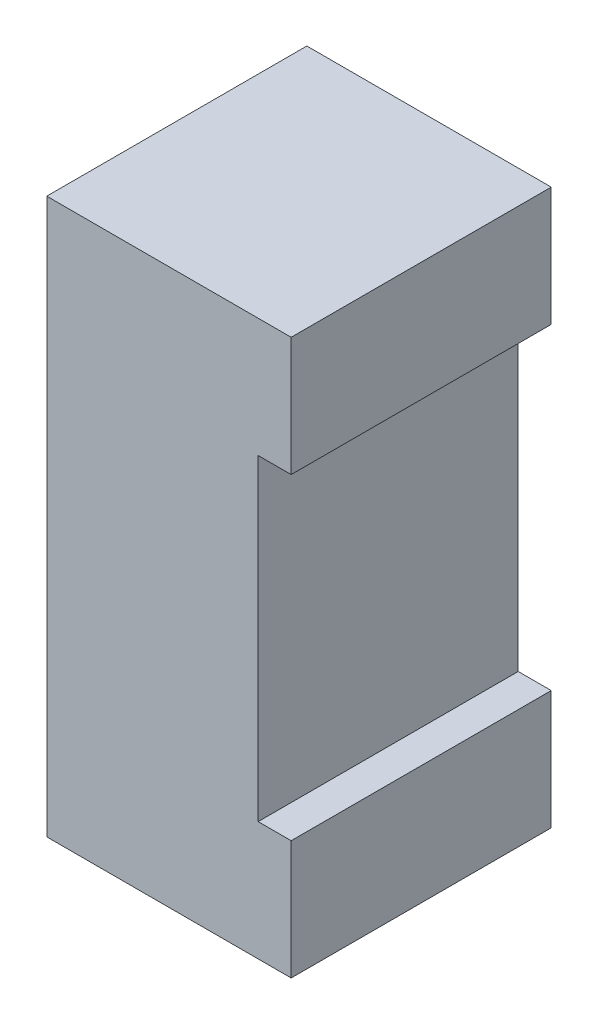
ISO-10303-21;
HEADER;
FILE_DESCRIPTION(('STEP AP214'),'2;1');
FILE_NAME('part.step','',(''),(''),'','','');
FILE_SCHEMA(('AUTOMOTIVE_DESIGN { 1 0 10303 214 1 1 1 1 }'));
ENDSEC;
DATA;
#1=APPLICATION_CONTEXT('core data for automotive mechanical design processes');
#2=APPLICATION_PROTOCOL_DEFINITION('international standard','automotive_design',2000,#1);
#3=PRODUCT_CONTEXT('',#1,'mechanical');
#4=PRODUCT('Part','Part','',(#3));
#5=PRODUCT_RELATED_PRODUCT_CATEGORY('part','',(#4));
#6=PRODUCT_DEFINITION_FORMATION('','',#4);
#7=PRODUCT_DEFINITION_CONTEXT('part definition',#1,'design');
#8=PRODUCT_DEFINITION('design','',#6,#7);
#9=PRODUCT_DEFINITION_SHAPE('','',#8);
#10=(LENGTH_UNIT() NAMED_UNIT(*) SI_UNIT(.MILLI.,.METRE.));
#11=(NAMED_UNIT(*) PLANE_ANGLE_UNIT() SI_UNIT($,.RADIAN.));
#12=(NAMED_UNIT(*) SI_UNIT($,.STERADIAN.) SOLID_ANGLE_UNIT());
#13=UNCERTAINTY_MEASURE_WITH_UNIT(LENGTH_MEASURE(1.E-05),#10,'distance_accuracy_value','');
#14=(GEOMETRIC_REPRESENTATION_CONTEXT(3) GLOBAL_UNCERTAINTY_ASSIGNED_CONTEXT((#13)) GLOBAL_UNIT_ASSIGNED_CONTEXT((#10,
#11,#12)) REPRESENTATION_CONTEXT('',''));
#15=CARTESIAN_POINT('',(0.,0.,0.));
#16=DIRECTION('',(0.,0.,1.));
#17=DIRECTION('',(1.,0.,0.));
#18=AXIS2_PLACEMENT_3D('',#15,#16,#17);
#19=CARTESIAN_POINT('',(1.7145,3.048,0.));
#20=DIRECTION('',(0.,1.,0.));
#21=DIRECTION('',(0.,0.,1.));
#22=AXIS2_PLACEMENT_3D('',#19,#20,#21);
#23=PLANE('',#22);
#24=DIRECTION('',(0.,0.,1.));
#25=VECTOR('',#24,1.);
#26=CARTESIAN_POINT('',(2.3495,3.048,0.));
#27=LINE('',#26,#25);
#28=CARTESIAN_POINT('',(2.3495,3.048,0.));
#29=VERTEX_POINT('',#28);
#30=CARTESIAN_POINT('',(2.3495,3.048,5.));
#31=VERTEX_POINT('',#30);
#32=EDGE_CURVE('E115',#29,#31,#27,.T.);
#33=ORIENTED_EDGE('',*,*,#32,.T.);
#34=DIRECTION('',(1.,0.,0.));
#35=VECTOR('',#34,1.);
#36=CARTESIAN_POINT('',(1.7145,3.048,5.));
#37=LINE('',#36,#35);
#38=CARTESIAN_POINT('',(1.7145,3.048,5.));
#39=VERTEX_POINT('',#38);
#40=EDGE_CURVE('E19',#39,#31,#37,.T.);
#41=ORIENTED_EDGE('',*,*,#40,.F.);
#42=DIRECTION('',(0.,0.,1.));
#43=VECTOR('',#42,1.);
#44=CARTESIAN_POINT('',(1.7145,3.048,0.));
#45=LINE('',#44,#43);
#46=CARTESIAN_POINT('',(1.7145,3.048,0.));
#47=VERTEX_POINT('',#46);
#48=EDGE_CURVE('E109',#39,#47,#45,.F.);
#49=ORIENTED_EDGE('',*,*,#48,.T.);
#50=DIRECTION('',(1.,0.,0.));
#51=VECTOR('',#50,1.);
#52=CARTESIAN_POINT('',(1.7145,3.048,0.));
#53=LINE('',#52,#51);
#54=EDGE_CURVE('E120',#29,#47,#53,.F.);
#55=ORIENTED_EDGE('',*,*,#54,.F.);
#56=EDGE_LOOP('',(#33,#41,#49,#55));
#57=FACE_BOUND('',#56,.T.);
#58=ADVANCED_FACE('F16',(#57),#23,.F.);
#59=CARTESIAN_POINT('',(2.3495,-3.048,0.));
#60=DIRECTION('',(0.,-1.,0.));
#61=DIRECTION('',(0.,0.,-1.));
#62=AXIS2_PLACEMENT_3D('',#59,#60,#61);
#63=PLANE('',#62);
#64=DIRECTION('',(0.,0.,1.));
#65=VECTOR('',#64,1.);
#66=CARTESIAN_POINT('',(1.7145,-3.048,0.));
#67=LINE('',#66,#65);
#68=CARTESIAN_POINT('',(1.7145,-3.048,0.));
#69=VERTEX_POINT('',#68);
#70=CARTESIAN_POINT('',(1.7145,-3.048,5.));
#71=VERTEX_POINT('',#70);
#72=EDGE_CURVE('E112',#69,#71,#67,.T.);
#73=ORIENTED_EDGE('',*,*,#72,.T.);
#74=DIRECTION('',(1.,0.,0.));
#75=VECTOR('',#74,1.);
#76=CARTESIAN_POINT('',(2.3495,-3.048,5.));
#77=LINE('',#76,#75);
#78=CARTESIAN_POINT('',(2.3495,-3.048,5.));
#79=VERTEX_POINT('',#78);
#80=EDGE_CURVE('E119',#79,#71,#77,.F.);
#81=ORIENTED_EDGE('',*,*,#80,.F.);
#82=DIRECTION('',(0.,0.,1.));
#83=VECTOR('',#82,1.);
#84=CARTESIAN_POINT('',(2.3495,-3.048,0.));
#85=LINE('',#84,#83);
#86=CARTESIAN_POINT('',(2.3495,-3.048,0.));
#87=VERTEX_POINT('',#86);
#88=EDGE_CURVE('E94',#79,#87,#85,.F.);
#89=ORIENTED_EDGE('',*,*,#88,.T.);
#90=DIRECTION('',(1.,0.,0.));
#91=VECTOR('',#90,1.);
#92=CARTESIAN_POINT('',(2.3495,-3.048,0.));
#93=LINE('',#92,#91);
#94=EDGE_CURVE('E117',#69,#87,#93,.T.);
#95=ORIENTED_EDGE('',*,*,#94,.F.);
#96=EDGE_LOOP('',(#73,#81,#89,#95));
#97=FACE_BOUND('',#96,.T.);
#98=ADVANCED_FACE('F149',(#97),#63,.F.);
#99=CARTESIAN_POINT('',(2.3495,3.048,0.));
#100=DIRECTION('',(-1.,0.,0.));
#101=DIRECTION('',(0.,0.,1.));
#102=AXIS2_PLACEMENT_3D('',#99,#100,#101);
#103=PLANE('',#102);
#104=DIRECTION('',(0.,0.,-1.));
#105=VECTOR('',#104,1.);
#106=CARTESIAN_POINT('',(2.3495,5.334,0.));
#107=LINE('',#106,#105);
#108=CARTESIAN_POINT('',(2.3495,5.334,0.));
#109=VERTEX_POINT('',#108);
#110=CARTESIAN_POINT('',(2.3495,5.334,5.));
#111=VERTEX_POINT('',#110);
#112=EDGE_CURVE('E83',#109,#111,#107,.F.);
#113=ORIENTED_EDGE('',*,*,#112,.T.);
#114=DIRECTION('',(0.,1.,0.));
#115=VECTOR('',#114,1.);
#116=CARTESIAN_POINT('',(2.3495,-5.334,5.));
#117=LINE('',#116,#115);
#118=EDGE_CURVE('E86',#111,#31,#117,.F.);
#119=ORIENTED_EDGE('',*,*,#118,.T.);
#120=ORIENTED_EDGE('',*,*,#32,.F.);
#121=DIRECTION('',(0.,1.,0.));
#122=VECTOR('',#121,1.);
#123=CARTESIAN_POINT('',(2.3495,-5.334,0.));
#124=LINE('',#123,#122);
#125=EDGE_CURVE('E88',#109,#29,#124,.F.);
#126=ORIENTED_EDGE('',*,*,#125,.F.);
#127=EDGE_LOOP('',(#113,#119,#120,#126));
#128=FACE_BOUND('',#127,.T.);
#129=ADVANCED_FACE('F84',(#128),#103,.F.);
#130=CARTESIAN_POINT('',(1.7145,-3.048,0.));
#131=DIRECTION('',(-1.,0.,0.));
#132=DIRECTION('',(0.,0.,1.));
#133=AXIS2_PLACEMENT_3D('',#130,#131,#132);
#134=PLANE('',#133);
#135=ORIENTED_EDGE('',*,*,#48,.F.);
#136=DIRECTION('',(0.,1.,0.));
#137=VECTOR('',#136,1.);
#138=CARTESIAN_POINT('',(1.7145,-5.334,5.));
#139=LINE('',#138,#137);
#140=EDGE_CURVE('E99',#39,#71,#139,.F.);
#141=ORIENTED_EDGE('',*,*,#140,.T.);
#142=ORIENTED_EDGE('',*,*,#72,.F.);
#143=DIRECTION('',(0.,1.,0.));
#144=VECTOR('',#143,1.);
#145=CARTESIAN_POINT('',(1.7145,-5.334,0.));
#146=LINE('',#145,#144);
#147=EDGE_CURVE('E124',#47,#69,#146,.F.);
#148=ORIENTED_EDGE('',*,*,#147,.F.);
#149=EDGE_LOOP('',(#135,#141,#142,#148));
#150=FACE_BOUND('',#149,.T.);
#151=ADVANCED_FACE('F130',(#150),#134,.F.);
#152=CARTESIAN_POINT('',(2.3495,-5.334,0.));
#153=DIRECTION('',(-1.,0.,0.));
#154=DIRECTION('',(0.,0.,1.));
#155=AXIS2_PLACEMENT_3D('',#152,#153,#154);
#156=PLANE('',#155);
#157=ORIENTED_EDGE('',*,*,#88,.F.);
#158=DIRECTION('',(0.,1.,0.));
#159=VECTOR('',#158,1.);
#160=CARTESIAN_POINT('',(2.3495,-5.334,5.));
#161=LINE('',#160,#159);
#162=CARTESIAN_POINT('',(2.3495,-5.334,5.));
#163=VERTEX_POINT('',#162);
#164=EDGE_CURVE('E145',#79,#163,#161,.F.);
#165=ORIENTED_EDGE('',*,*,#164,.T.);
#166=DIRECTION('',(0.,0.,1.));
#167=VECTOR('',#166,1.);
#168=CARTESIAN_POINT('',(2.3495,-5.334,0.));
#169=LINE('',#168,#167);
#170=CARTESIAN_POINT('',(2.3495,-5.334,0.));
#171=VERTEX_POINT('',#170);
#172=EDGE_CURVE('E140',#163,#171,#169,.F.);
#173=ORIENTED_EDGE('',*,*,#172,.T.);
#174=DIRECTION('',(0.,1.,0.));
#175=VECTOR('',#174,1.);
#176=CARTESIAN_POINT('',(2.3495,-5.334,0.));
#177=LINE('',#176,#175);
#178=EDGE_CURVE('E131',#87,#171,#177,.F.);
#179=ORIENTED_EDGE('',*,*,#178,.F.);
#180=EDGE_LOOP('',(#157,#165,#173,#179));
#181=FACE_BOUND('',#180,.T.);
#182=ADVANCED_FACE('F176',(#181),#156,.F.);
#183=CARTESIAN_POINT('',(2.3495,5.334,0.));
#184=DIRECTION('',(0.,-1.,0.));
#185=DIRECTION('',(0.,0.,-1.));
#186=AXIS2_PLACEMENT_3D('',#183,#184,#185);
#187=PLANE('',#186);
#188=DIRECTION('',(0.,0.,-1.));
#189=VECTOR('',#188,1.);
#190=CARTESIAN_POINT('',(-2.3495,5.334,0.));
#191=LINE('',#190,#189);
#192=CARTESIAN_POINT('',(-2.3495,5.334,0.));
#193=VERTEX_POINT('',#192);
#194=CARTESIAN_POINT('',(-2.3495,5.334,5.));
#195=VERTEX_POINT('',#194);
#196=EDGE_CURVE('E103',#193,#195,#191,.F.);
#197=ORIENTED_EDGE('',*,*,#196,.T.);
#198=DIRECTION('',(-1.,0.,0.));
#199=VECTOR('',#198,1.);
#200=CARTESIAN_POINT('',(2.3495,5.334,5.));
#201=LINE('',#200,#199);
#202=EDGE_CURVE('E93',#195,#111,#201,.F.);
#203=ORIENTED_EDGE('',*,*,#202,.T.);
#204=ORIENTED_EDGE('',*,*,#112,.F.);
#205=DIRECTION('',(-1.,0.,0.));
#206=VECTOR('',#205,1.);
#207=CARTESIAN_POINT('',(2.3495,5.334,0.));
#208=LINE('',#207,#206);
#209=EDGE_CURVE('E134',#193,#109,#208,.F.);
#210=ORIENTED_EDGE('',*,*,#209,.F.);
#211=EDGE_LOOP('',(#197,#203,#204,#210));
#212=FACE_BOUND('',#211,.T.);
#213=ADVANCED_FACE('F102',(#212),#187,.F.);
#214=CARTESIAN_POINT('',(2.3495,-5.334,5.));
#215=DIRECTION('',(0.,0.,-1.));
#216=DIRECTION('',(-1.,0.,0.));
#217=AXIS2_PLACEMENT_3D('',#214,#215,#216);
#218=PLANE('',#217);
#219=ORIENTED_EDGE('',*,*,#80,.T.);
#220=ORIENTED_EDGE('',*,*,#140,.F.);
#221=ORIENTED_EDGE('',*,*,#40,.T.);
#222=ORIENTED_EDGE('',*,*,#118,.F.);
#223=ORIENTED_EDGE('',*,*,#202,.F.);
#224=DIRECTION('',(0.,1.,0.));
#225=VECTOR('',#224,1.);
#226=CARTESIAN_POINT('',(-2.3495,5.334,5.));
#227=LINE('',#226,#225);
#228=CARTESIAN_POINT('',(-2.3495,-5.334,5.));
#229=VERTEX_POINT('',#228);
#230=EDGE_CURVE('E158',#195,#229,#227,.F.);
#231=ORIENTED_EDGE('',*,*,#230,.T.);
#232=DIRECTION('',(1.,0.,0.));
#233=VECTOR('',#232,1.);
#234=CARTESIAN_POINT('',(-2.3495,-5.334,5.));
#235=LINE('',#234,#233);
#236=EDGE_CURVE('E142',#229,#163,#235,.T.);
#237=ORIENTED_EDGE('',*,*,#236,.T.);
#238=ORIENTED_EDGE('',*,*,#164,.F.);
#239=EDGE_LOOP('',(#219,#220,#221,#222,#223,#231,#237,#238));
#240=FACE_BOUND('',#239,.T.);
#241=ADVANCED_FACE('F96',(#240),#218,.F.);
#242=CARTESIAN_POINT('',(-2.3495,-5.334,0.));
#243=DIRECTION('',(0.,1.,0.));
#244=DIRECTION('',(0.,0.,1.));
#245=AXIS2_PLACEMENT_3D('',#242,#243,#244);
#246=PLANE('',#245);
#247=ORIENTED_EDGE('',*,*,#172,.F.);
#248=ORIENTED_EDGE('',*,*,#236,.F.);
#249=DIRECTION('',(0.,0.,-1.));
#250=VECTOR('',#249,1.);
#251=CARTESIAN_POINT('',(-2.3495,-5.334,0.));
#252=LINE('',#251,#250);
#253=CARTESIAN_POINT('',(-2.3495,-5.334,0.));
#254=VERTEX_POINT('',#253);
#255=EDGE_CURVE('E25',#229,#254,#252,.T.);
#256=ORIENTED_EDGE('',*,*,#255,.T.);
#257=DIRECTION('',(-1.,0.,0.));
#258=VECTOR('',#257,1.);
#259=CARTESIAN_POINT('',(2.3495,-5.334,0.));
#260=LINE('',#259,#258);
#261=EDGE_CURVE('E33',#171,#254,#260,.T.);
#262=ORIENTED_EDGE('',*,*,#261,.F.);
#263=EDGE_LOOP('',(#247,#248,#256,#262));
#264=FACE_BOUND('',#263,.T.);
#265=ADVANCED_FACE('F155',(#264),#246,.F.);
#266=CARTESIAN_POINT('',(2.3495,-5.334,0.));
#267=DIRECTION('',(0.,0.,-1.));
#268=DIRECTION('',(-1.,0.,0.));
#269=AXIS2_PLACEMENT_3D('',#266,#267,#268);
#270=PLANE('',#269);
#271=ORIENTED_EDGE('',*,*,#94,.T.);
#272=ORIENTED_EDGE('',*,*,#178,.T.);
#273=ORIENTED_EDGE('',*,*,#261,.T.);
#274=DIRECTION('',(0.,1.,0.));
#275=VECTOR('',#274,1.);
#276=CARTESIAN_POINT('',(-2.3495,5.334,0.));
#277=LINE('',#276,#275);
#278=EDGE_CURVE('E10',#254,#193,#277,.T.);
#279=ORIENTED_EDGE('',*,*,#278,.T.);
#280=ORIENTED_EDGE('',*,*,#209,.T.);
#281=ORIENTED_EDGE('',*,*,#125,.T.);
#282=ORIENTED_EDGE('',*,*,#54,.T.);
#283=ORIENTED_EDGE('',*,*,#147,.T.);
#284=EDGE_LOOP('',(#271,#272,#273,#279,#280,#281,#282,#283));
#285=FACE_BOUND('',#284,.T.);
#286=ADVANCED_FACE('F122',(#285),#270,.T.);
#287=CARTESIAN_POINT('',(-2.3495,5.334,0.));
#288=DIRECTION('',(1.,0.,0.));
#289=DIRECTION('',(0.,0.,-1.));
#290=AXIS2_PLACEMENT_3D('',#287,#288,#289);
#291=PLANE('',#290);
#292=ORIENTED_EDGE('',*,*,#255,.F.);
#293=ORIENTED_EDGE('',*,*,#230,.F.);
#294=ORIENTED_EDGE('',*,*,#196,.F.);
#295=ORIENTED_EDGE('',*,*,#278,.F.);
#296=EDGE_LOOP('',(#292,#293,#294,#295));
#297=FACE_BOUND('',#296,.T.);
#298=ADVANCED_FACE('F161',(#297),#291,.F.);
#299=CLOSED_SHELL('',(#58,#98,#129,#151,#182,#213,#241,#265,#286,#298));
#300=MANIFOLD_SOLID_BREP('B1',#299);
#301=ADVANCED_BREP_SHAPE_REPRESENTATION('',(#18,#300),#14);
#302=SHAPE_DEFINITION_REPRESENTATION(#9,#301);
ENDSEC;
END-ISO-10303-21;
